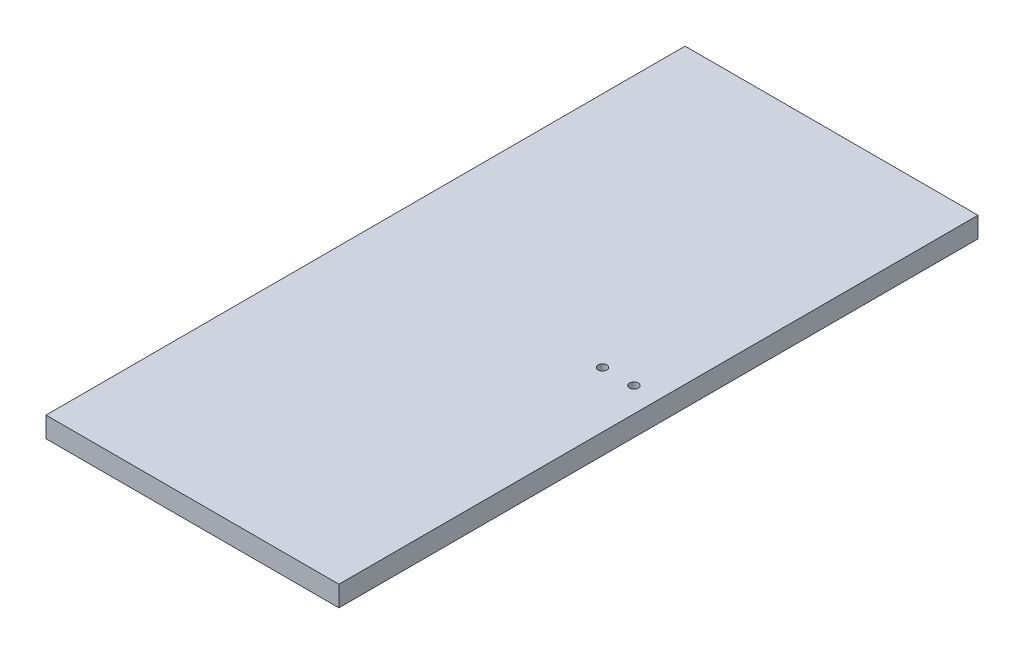
ISO-10303-21;
HEADER;
FILE_DESCRIPTION(('STEP AP214'),'2;1');
FILE_NAME('part.step','',(''),(''),'','','');
FILE_SCHEMA(('AUTOMOTIVE_DESIGN { 1 0 10303 214 1 1 1 1 }'));
ENDSEC;
DATA;
#1=APPLICATION_CONTEXT('core data for automotive mechanical design processes');
#2=APPLICATION_PROTOCOL_DEFINITION('international standard','automotive_design',2000,#1);
#3=PRODUCT_CONTEXT('',#1,'mechanical');
#4=PRODUCT('Part','Part','',(#3));
#5=PRODUCT_RELATED_PRODUCT_CATEGORY('part','',(#4));
#6=PRODUCT_DEFINITION_FORMATION('','',#4);
#7=PRODUCT_DEFINITION_CONTEXT('part definition',#1,'design');
#8=PRODUCT_DEFINITION('design','',#6,#7);
#9=PRODUCT_DEFINITION_SHAPE('','',#8);
#10=(LENGTH_UNIT() NAMED_UNIT(*) SI_UNIT(.MILLI.,.METRE.));
#11=(NAMED_UNIT(*) PLANE_ANGLE_UNIT() SI_UNIT($,.RADIAN.));
#12=(NAMED_UNIT(*) SI_UNIT($,.STERADIAN.) SOLID_ANGLE_UNIT());
#13=UNCERTAINTY_MEASURE_WITH_UNIT(LENGTH_MEASURE(1.E-05),#10,'distance_accuracy_value','');
#14=(GEOMETRIC_REPRESENTATION_CONTEXT(3) GLOBAL_UNCERTAINTY_ASSIGNED_CONTEXT((#13)) GLOBAL_UNIT_ASSIGNED_CONTEXT((#10,
#11,#12)) REPRESENTATION_CONTEXT('',''));
#15=CARTESIAN_POINT('',(0.,0.,0.));
#16=DIRECTION('',(0.,0.,1.));
#17=DIRECTION('',(1.,0.,0.));
#18=AXIS2_PLACEMENT_3D('',#15,#16,#17);
#19=CARTESIAN_POINT('',(0.,0.,304.8));
#20=DIRECTION('',(1.,0.,0.));
#21=DIRECTION('',(0.,0.,-1.));
#22=AXIS2_PLACEMENT_3D('',#19,#20,#21);
#23=PLANE('',#22);
#24=DIRECTION('',(0.,-1.,0.));
#25=VECTOR('',#24,1.);
#26=CARTESIAN_POINT('',(0.,0.,0.));
#27=LINE('',#26,#25);
#28=CARTESIAN_POINT('',(0.,9.779,0.));
#29=VERTEX_POINT('',#28);
#30=CARTESIAN_POINT('',(0.,0.,0.));
#31=VERTEX_POINT('',#30);
#32=EDGE_CURVE('E97',#29,#31,#27,.T.);
#33=ORIENTED_EDGE('',*,*,#32,.T.);
#34=DIRECTION('',(0.,0.,-1.));
#35=VECTOR('',#34,1.);
#36=CARTESIAN_POINT('',(0.,0.,304.8));
#37=LINE('',#36,#35);
#38=CARTESIAN_POINT('',(0.,0.,304.8));
#39=VERTEX_POINT('',#38);
#40=EDGE_CURVE('E11',#39,#31,#37,.T.);
#41=ORIENTED_EDGE('',*,*,#40,.F.);
#42=DIRECTION('',(0.,-1.,0.));
#43=VECTOR('',#42,1.);
#44=CARTESIAN_POINT('',(0.,0.,304.8));
#45=LINE('',#44,#43);
#46=CARTESIAN_POINT('',(0.,9.779,304.8));
#47=VERTEX_POINT('',#46);
#48=EDGE_CURVE('E85',#47,#39,#45,.T.);
#49=ORIENTED_EDGE('',*,*,#48,.F.);
#50=DIRECTION('',(0.,0.,-1.));
#51=VECTOR('',#50,1.);
#52=CARTESIAN_POINT('',(0.,9.779,304.8));
#53=LINE('',#52,#51);
#54=EDGE_CURVE('E93',#47,#29,#53,.T.);
#55=ORIENTED_EDGE('',*,*,#54,.T.);
#56=EDGE_LOOP('',(#33,#41,#49,#55));
#57=FACE_BOUND('',#56,.T.);
#58=ADVANCED_FACE('F34',(#57),#23,.F.);
#59=CARTESIAN_POINT('',(0.,0.,304.8));
#60=DIRECTION('',(0.,1.,0.));
#61=DIRECTION('',(0.,0.,1.));
#62=AXIS2_PLACEMENT_3D('',#59,#60,#61);
#63=PLANE('',#62);
#64=CARTESIAN_POINT('',(113.016,0.,152.4));
#65=DIRECTION('',(0.,1.,0.));
#66=DIRECTION('',(0.,0.,1.));
#67=AXIS2_PLACEMENT_3D('',#64,#65,#66);
#68=CIRCLE('',#67,2.09999999099999);
#69=CARTESIAN_POINT('',(113.016,0.,154.499999991));
#70=VERTEX_POINT('',#69);
#71=EDGE_CURVE('E100',#70,#70,#68,.F.);
#72=ORIENTED_EDGE('',*,*,#71,.F.);
#73=EDGE_LOOP('',(#72));
#74=FACE_BOUND('',#73,.T.);
#75=CARTESIAN_POINT('',(128.016,0.,152.4));
#76=DIRECTION('',(0.,1.,0.));
#77=DIRECTION('',(0.,0.,1.));
#78=AXIS2_PLACEMENT_3D('',#75,#76,#77);
#79=CIRCLE('',#78,2.09999999100001);
#80=CARTESIAN_POINT('',(128.016,0.,154.499999991));
#81=VERTEX_POINT('',#80);
#82=EDGE_CURVE('E114',#81,#81,#79,.F.);
#83=ORIENTED_EDGE('',*,*,#82,.F.);
#84=EDGE_LOOP('',(#83));
#85=FACE_BOUND('',#84,.T.);
#86=DIRECTION('',(1.,0.,0.));
#87=VECTOR('',#86,1.);
#88=CARTESIAN_POINT('',(0.,0.,0.));
#89=LINE('',#88,#87);
#90=CARTESIAN_POINT('',(139.7,0.,0.));
#91=VERTEX_POINT('',#90);
#92=EDGE_CURVE('E89',#31,#91,#89,.T.);
#93=ORIENTED_EDGE('',*,*,#92,.T.);
#94=DIRECTION('',(0.,0.,-1.));
#95=VECTOR('',#94,1.);
#96=CARTESIAN_POINT('',(139.7,0.,304.8));
#97=LINE('',#96,#95);
#98=CARTESIAN_POINT('',(139.7,0.,304.8));
#99=VERTEX_POINT('',#98);
#100=EDGE_CURVE('E42',#99,#91,#97,.T.);
#101=ORIENTED_EDGE('',*,*,#100,.F.);
#102=DIRECTION('',(1.,0.,0.));
#103=VECTOR('',#102,1.);
#104=CARTESIAN_POINT('',(0.,0.,304.8));
#105=LINE('',#104,#103);
#106=EDGE_CURVE('E80',#39,#99,#105,.T.);
#107=ORIENTED_EDGE('',*,*,#106,.F.);
#108=ORIENTED_EDGE('',*,*,#40,.T.);
#109=EDGE_LOOP('',(#93,#101,#107,#108));
#110=FACE_BOUND('',#109,.T.);
#111=ADVANCED_FACE('F88',(#74,#85,#110),#63,.F.);
#112=CARTESIAN_POINT('',(139.7,0.,304.8));
#113=DIRECTION('',(-1.,0.,0.));
#114=DIRECTION('',(0.,0.,1.));
#115=AXIS2_PLACEMENT_3D('',#112,#113,#114);
#116=PLANE('',#115);
#117=DIRECTION('',(0.,1.,0.));
#118=VECTOR('',#117,1.);
#119=CARTESIAN_POINT('',(139.7,0.,0.));
#120=LINE('',#119,#118);
#121=CARTESIAN_POINT('',(139.7,9.779,0.));
#122=VERTEX_POINT('',#121);
#123=EDGE_CURVE('E67',#91,#122,#120,.T.);
#124=ORIENTED_EDGE('',*,*,#123,.T.);
#125=DIRECTION('',(0.,0.,-1.));
#126=VECTOR('',#125,1.);
#127=CARTESIAN_POINT('',(139.7,9.779,304.8));
#128=LINE('',#127,#126);
#129=CARTESIAN_POINT('',(139.7,9.779,304.8));
#130=VERTEX_POINT('',#129);
#131=EDGE_CURVE('E90',#130,#122,#128,.T.);
#132=ORIENTED_EDGE('',*,*,#131,.F.);
#133=DIRECTION('',(0.,1.,0.));
#134=VECTOR('',#133,1.);
#135=CARTESIAN_POINT('',(139.7,0.,304.8));
#136=LINE('',#135,#134);
#137=EDGE_CURVE('E83',#99,#130,#136,.T.);
#138=ORIENTED_EDGE('',*,*,#137,.F.);
#139=ORIENTED_EDGE('',*,*,#100,.T.);
#140=EDGE_LOOP('',(#124,#132,#138,#139));
#141=FACE_BOUND('',#140,.T.);
#142=ADVANCED_FACE('F91',(#141),#116,.F.);
#143=CARTESIAN_POINT('',(0.,9.779,304.8));
#144=DIRECTION('',(0.,-1.,0.));
#145=DIRECTION('',(0.,0.,-1.));
#146=AXIS2_PLACEMENT_3D('',#143,#144,#145);
#147=PLANE('',#146);
#148=CARTESIAN_POINT('',(113.016,9.779,152.4));
#149=DIRECTION('',(0.,1.,0.));
#150=DIRECTION('',(0.,0.,1.));
#151=AXIS2_PLACEMENT_3D('',#148,#149,#150);
#152=CIRCLE('',#151,2.09999999099999);
#153=CARTESIAN_POINT('',(113.016,9.779,154.499999991));
#154=VERTEX_POINT('',#153);
#155=EDGE_CURVE('E117',#154,#154,#152,.F.);
#156=ORIENTED_EDGE('',*,*,#155,.T.);
#157=EDGE_LOOP('',(#156));
#158=FACE_BOUND('',#157,.T.);
#159=CARTESIAN_POINT('',(128.016,9.779,152.4));
#160=DIRECTION('',(0.,1.,0.));
#161=DIRECTION('',(0.,0.,1.));
#162=AXIS2_PLACEMENT_3D('',#159,#160,#161);
#163=CIRCLE('',#162,2.09999999100001);
#164=CARTESIAN_POINT('',(128.016,9.779,154.499999991));
#165=VERTEX_POINT('',#164);
#166=EDGE_CURVE('E111',#165,#165,#163,.F.);
#167=ORIENTED_EDGE('',*,*,#166,.T.);
#168=EDGE_LOOP('',(#167));
#169=FACE_BOUND('',#168,.T.);
#170=DIRECTION('',(-1.,0.,0.));
#171=VECTOR('',#170,1.);
#172=CARTESIAN_POINT('',(0.,9.779,0.));
#173=LINE('',#172,#171);
#174=EDGE_CURVE('E73',#122,#29,#173,.T.);
#175=ORIENTED_EDGE('',*,*,#174,.T.);
#176=ORIENTED_EDGE('',*,*,#54,.F.);
#177=DIRECTION('',(-1.,0.,0.));
#178=VECTOR('',#177,1.);
#179=CARTESIAN_POINT('',(0.,9.779,304.8));
#180=LINE('',#179,#178);
#181=EDGE_CURVE('E50',#130,#47,#180,.T.);
#182=ORIENTED_EDGE('',*,*,#181,.F.);
#183=ORIENTED_EDGE('',*,*,#131,.T.);
#184=EDGE_LOOP('',(#175,#176,#182,#183));
#185=FACE_BOUND('',#184,.T.);
#186=ADVANCED_FACE('F105',(#158,#169,#185),#147,.F.);
#187=CARTESIAN_POINT('',(0.,0.,304.8));
#188=DIRECTION('',(0.,0.,-1.));
#189=DIRECTION('',(-1.,0.,0.));
#190=AXIS2_PLACEMENT_3D('',#187,#188,#189);
#191=PLANE('',#190);
#192=ORIENTED_EDGE('',*,*,#48,.T.);
#193=ORIENTED_EDGE('',*,*,#106,.T.);
#194=ORIENTED_EDGE('',*,*,#137,.T.);
#195=ORIENTED_EDGE('',*,*,#181,.T.);
#196=EDGE_LOOP('',(#192,#193,#194,#195));
#197=FACE_BOUND('',#196,.T.);
#198=ADVANCED_FACE('F81',(#197),#191,.F.);
#199=CARTESIAN_POINT('',(0.,0.,0.));
#200=DIRECTION('',(0.,0.,-1.));
#201=DIRECTION('',(-1.,0.,0.));
#202=AXIS2_PLACEMENT_3D('',#199,#200,#201);
#203=PLANE('',#202);
#204=ORIENTED_EDGE('',*,*,#32,.F.);
#205=ORIENTED_EDGE('',*,*,#174,.F.);
#206=ORIENTED_EDGE('',*,*,#123,.F.);
#207=ORIENTED_EDGE('',*,*,#92,.F.);
#208=EDGE_LOOP('',(#204,#205,#206,#207));
#209=FACE_BOUND('',#208,.T.);
#210=ADVANCED_FACE('F108',(#209),#203,.T.);
#211=CARTESIAN_POINT('',(128.016,0.,152.4));
#212=DIRECTION('',(0.,1.,0.));
#213=DIRECTION('',(0.,0.,1.));
#214=AXIS2_PLACEMENT_3D('',#211,#212,#213);
#215=CYLINDRICAL_SURFACE('',#214,2.09999999100001);
#216=ORIENTED_EDGE('',*,*,#82,.T.);
#217=EDGE_LOOP('',(#216));
#218=FACE_BOUND('',#217,.T.);
#219=ORIENTED_EDGE('',*,*,#166,.F.);
#220=EDGE_LOOP('',(#219));
#221=FACE_BOUND('',#220,.T.);
#222=ADVANCED_FACE('F130',(#218,#221),#215,.F.);
#223=CARTESIAN_POINT('',(113.016,0.,152.4));
#224=DIRECTION('',(0.,1.,0.));
#225=DIRECTION('',(0.,0.,1.));
#226=AXIS2_PLACEMENT_3D('',#223,#224,#225);
#227=CYLINDRICAL_SURFACE('',#226,2.09999999099999);
#228=ORIENTED_EDGE('',*,*,#71,.T.);
#229=EDGE_LOOP('',(#228));
#230=FACE_BOUND('',#229,.T.);
#231=ORIENTED_EDGE('',*,*,#155,.F.);
#232=EDGE_LOOP('',(#231));
#233=FACE_BOUND('',#232,.T.);
#234=ADVANCED_FACE('F123',(#230,#233),#227,.F.);
#235=CLOSED_SHELL('',(#58,#111,#142,#186,#198,#210,#222,#234));
#236=MANIFOLD_SOLID_BREP('B2',#235);
#237=ADVANCED_BREP_SHAPE_REPRESENTATION('',(#18,#236),#14);
#238=SHAPE_DEFINITION_REPRESENTATION(#9,#237);
ENDSEC;
END-ISO-10303-21;
